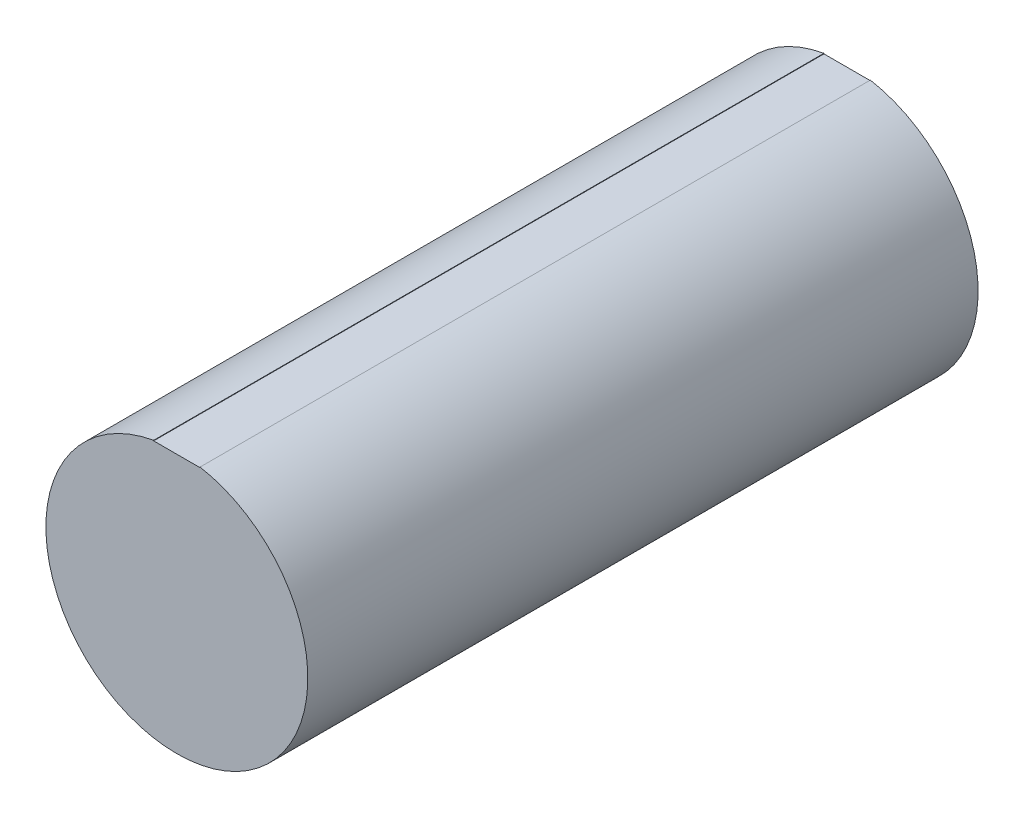
ISO-10303-21;
HEADER;
FILE_DESCRIPTION(('STEP AP214'),'2;1');
FILE_NAME('part.step','',(''),(''),'','','');
FILE_SCHEMA(('AUTOMOTIVE_DESIGN { 1 0 10303 214 1 1 1 1 }'));
ENDSEC;
DATA;
#1=APPLICATION_CONTEXT('core data for automotive mechanical design processes');
#2=APPLICATION_PROTOCOL_DEFINITION('international standard','automotive_design',2000,#1);
#3=PRODUCT_CONTEXT('',#1,'mechanical');
#4=PRODUCT('Part','Part','',(#3));
#5=PRODUCT_RELATED_PRODUCT_CATEGORY('part','',(#4));
#6=PRODUCT_DEFINITION_FORMATION('','',#4);
#7=PRODUCT_DEFINITION_CONTEXT('part definition',#1,'design');
#8=PRODUCT_DEFINITION('design','',#6,#7);
#9=PRODUCT_DEFINITION_SHAPE('','',#8);
#10=(LENGTH_UNIT() NAMED_UNIT(*) SI_UNIT(.MILLI.,.METRE.));
#11=(NAMED_UNIT(*) PLANE_ANGLE_UNIT() SI_UNIT($,.RADIAN.));
#12=(NAMED_UNIT(*) SI_UNIT($,.STERADIAN.) SOLID_ANGLE_UNIT());
#13=UNCERTAINTY_MEASURE_WITH_UNIT(LENGTH_MEASURE(1.E-05),#10,'distance_accuracy_value','');
#14=(GEOMETRIC_REPRESENTATION_CONTEXT(3) GLOBAL_UNCERTAINTY_ASSIGNED_CONTEXT((#13)) GLOBAL_UNIT_ASSIGNED_CONTEXT((#10,
#11,#12)) REPRESENTATION_CONTEXT('',''));
#15=CARTESIAN_POINT('',(0.,0.,0.));
#16=DIRECTION('',(0.,0.,1.));
#17=DIRECTION('',(1.,0.,0.));
#18=AXIS2_PLACEMENT_3D('',#15,#16,#17);
#19=CARTESIAN_POINT('',(0.,0.,130.));
#20=DIRECTION('',(0.,0.,-1.));
#21=DIRECTION('',(-1.,0.,0.));
#22=AXIS2_PLACEMENT_3D('',#19,#20,#21);
#23=CYLINDRICAL_SURFACE('',#22,25.4);
#24=CARTESIAN_POINT('',(0.,0.,0.));
#25=DIRECTION('',(0.,0.,1.));
#26=DIRECTION('',(1.,0.,0.));
#27=AXIS2_PLACEMENT_3D('',#24,#25,#26);
#28=CIRCLE('',#27,25.4);
#29=CARTESIAN_POINT('',(-4.50000000000003,24.9981999351953,0.));
#30=VERTEX_POINT('',#29);
#31=CARTESIAN_POINT('',(4.49999999999997,24.9981999351953,0.));
#32=VERTEX_POINT('',#31);
#33=EDGE_CURVE('E101',#30,#32,#28,.T.);
#34=ORIENTED_EDGE('',*,*,#33,.T.);
#35=DIRECTION('',(0.,0.,-1.));
#36=VECTOR('',#35,1.);
#37=CARTESIAN_POINT('',(4.49999999999997,24.9981999351953,130.));
#38=LINE('',#37,#36);
#39=CARTESIAN_POINT('',(4.49999999999997,24.9981999351953,130.));
#40=VERTEX_POINT('',#39);
#41=EDGE_CURVE('E99',#32,#40,#38,.F.);
#42=ORIENTED_EDGE('',*,*,#41,.T.);
#43=CARTESIAN_POINT('',(0.,0.,130.));
#44=DIRECTION('',(0.,0.,1.));
#45=DIRECTION('',(1.,0.,0.));
#46=AXIS2_PLACEMENT_3D('',#43,#44,#45);
#47=CIRCLE('',#46,25.4);
#48=CARTESIAN_POINT('',(-4.50000000000003,24.9981999351953,130.));
#49=VERTEX_POINT('',#48);
#50=EDGE_CURVE('E42',#49,#40,#47,.T.);
#51=ORIENTED_EDGE('',*,*,#50,.F.);
#52=DIRECTION('',(0.,0.,-1.));
#53=VECTOR('',#52,1.);
#54=CARTESIAN_POINT('',(-4.50000000000003,24.9981999351953,130.));
#55=LINE('',#54,#53);
#56=EDGE_CURVE('E76',#49,#30,#55,.T.);
#57=ORIENTED_EDGE('',*,*,#56,.T.);
#58=EDGE_LOOP('',(#34,#42,#51,#57));
#59=FACE_BOUND('',#58,.T.);
#60=ADVANCED_FACE('F35',(#59),#23,.T.);
#61=CARTESIAN_POINT('',(0.,0.,130.));
#62=DIRECTION('',(0.,0.,1.));
#63=DIRECTION('',(1.,0.,0.));
#64=AXIS2_PLACEMENT_3D('',#61,#62,#63);
#65=PLANE('',#64);
#66=DIRECTION('',(0.,1.,0.));
#67=VECTOR('',#66,1.);
#68=CARTESIAN_POINT('',(4.49999999999997,24.9,130.));
#69=LINE('',#68,#67);
#70=CARTESIAN_POINT('',(4.49999999999997,24.9,130.));
#71=VERTEX_POINT('',#70);
#72=EDGE_CURVE('E57',#71,#40,#69,.T.);
#73=ORIENTED_EDGE('',*,*,#72,.F.);
#74=DIRECTION('',(1.,0.,0.));
#75=VECTOR('',#74,1.);
#76=CARTESIAN_POINT('',(-4.50000000000003,24.9,130.));
#77=LINE('',#76,#75);
#78=CARTESIAN_POINT('',(-4.50000000000003,24.9,130.));
#79=VERTEX_POINT('',#78);
#80=EDGE_CURVE('E81',#79,#71,#77,.T.);
#81=ORIENTED_EDGE('',*,*,#80,.F.);
#82=DIRECTION('',(0.,-1.,0.));
#83=VECTOR('',#82,1.);
#84=CARTESIAN_POINT('',(-4.50000000000003,24.9,130.));
#85=LINE('',#84,#83);
#86=EDGE_CURVE('E73',#49,#79,#85,.T.);
#87=ORIENTED_EDGE('',*,*,#86,.F.);
#88=ORIENTED_EDGE('',*,*,#50,.T.);
#89=EDGE_LOOP('',(#73,#81,#87,#88));
#90=FACE_BOUND('',#89,.T.);
#91=ADVANCED_FACE('F92',(#90),#65,.T.);
#92=CARTESIAN_POINT('',(0.,0.,0.));
#93=DIRECTION('',(0.,0.,1.));
#94=DIRECTION('',(1.,0.,0.));
#95=AXIS2_PLACEMENT_3D('',#92,#93,#94);
#96=PLANE('',#95);
#97=DIRECTION('',(-1.,0.,0.));
#98=VECTOR('',#97,1.);
#99=CARTESIAN_POINT('',(-4.50000000000003,24.9,0.));
#100=LINE('',#99,#98);
#101=CARTESIAN_POINT('',(4.49999999999997,24.9,0.));
#102=VERTEX_POINT('',#101);
#103=CARTESIAN_POINT('',(-4.50000000000003,24.9,0.));
#104=VERTEX_POINT('',#103);
#105=EDGE_CURVE('E88',#102,#104,#100,.T.);
#106=ORIENTED_EDGE('',*,*,#105,.F.);
#107=DIRECTION('',(0.,1.,0.));
#108=VECTOR('',#107,1.);
#109=CARTESIAN_POINT('',(4.49999999999997,0.,0.));
#110=LINE('',#109,#108);
#111=EDGE_CURVE('E11',#102,#32,#110,.T.);
#112=ORIENTED_EDGE('',*,*,#111,.T.);
#113=ORIENTED_EDGE('',*,*,#33,.F.);
#114=DIRECTION('',(0.,1.,0.));
#115=VECTOR('',#114,1.);
#116=CARTESIAN_POINT('',(-4.50000000000003,24.9,0.));
#117=LINE('',#116,#115);
#118=EDGE_CURVE('E96',#104,#30,#117,.T.);
#119=ORIENTED_EDGE('',*,*,#118,.F.);
#120=EDGE_LOOP('',(#106,#112,#113,#119));
#121=FACE_BOUND('',#120,.T.);
#122=ADVANCED_FACE('F106',(#121),#96,.F.);
#123=CARTESIAN_POINT('',(4.49999999999997,24.9,-9.05538513813742));
#124=DIRECTION('',(1.,0.,0.));
#125=DIRECTION('',(0.,0.,-1.));
#126=AXIS2_PLACEMENT_3D('',#123,#124,#125);
#127=PLANE('',#126);
#128=ORIENTED_EDGE('',*,*,#111,.F.);
#129=DIRECTION('',(0.,0.,1.));
#130=VECTOR('',#129,1.);
#131=CARTESIAN_POINT('',(4.49999999999997,24.9,-9.05538513813742));
#132=LINE('',#131,#130);
#133=EDGE_CURVE('E90',#102,#71,#132,.T.);
#134=ORIENTED_EDGE('',*,*,#133,.T.);
#135=ORIENTED_EDGE('',*,*,#72,.T.);
#136=ORIENTED_EDGE('',*,*,#41,.F.);
#137=EDGE_LOOP('',(#128,#134,#135,#136));
#138=FACE_BOUND('',#137,.T.);
#139=ADVANCED_FACE('F107',(#138),#127,.F.);
#140=CARTESIAN_POINT('',(-4.50000000000003,24.9,-9.05538513813742));
#141=DIRECTION('',(-1.,0.,0.));
#142=DIRECTION('',(0.,0.,1.));
#143=AXIS2_PLACEMENT_3D('',#140,#141,#142);
#144=PLANE('',#143);
#145=ORIENTED_EDGE('',*,*,#86,.T.);
#146=DIRECTION('',(0.,0.,1.));
#147=VECTOR('',#146,1.);
#148=CARTESIAN_POINT('',(-4.50000000000003,24.9,-9.05538513813742));
#149=LINE('',#148,#147);
#150=EDGE_CURVE('E49',#104,#79,#149,.T.);
#151=ORIENTED_EDGE('',*,*,#150,.F.);
#152=ORIENTED_EDGE('',*,*,#118,.T.);
#153=ORIENTED_EDGE('',*,*,#56,.F.);
#154=EDGE_LOOP('',(#145,#151,#152,#153));
#155=FACE_BOUND('',#154,.T.);
#156=ADVANCED_FACE('F74',(#155),#144,.F.);
#157=CARTESIAN_POINT('',(-4.50000000000003,24.9,-9.05538513813742));
#158=DIRECTION('',(0.,-1.,0.));
#159=DIRECTION('',(0.,0.,-1.));
#160=AXIS2_PLACEMENT_3D('',#157,#158,#159);
#161=PLANE('',#160);
#162=ORIENTED_EDGE('',*,*,#105,.T.);
#163=ORIENTED_EDGE('',*,*,#150,.T.);
#164=ORIENTED_EDGE('',*,*,#80,.T.);
#165=ORIENTED_EDGE('',*,*,#133,.F.);
#166=EDGE_LOOP('',(#162,#163,#164,#165));
#167=FACE_BOUND('',#166,.T.);
#168=ADVANCED_FACE('F85',(#167),#161,.F.);
#169=CLOSED_SHELL('',(#60,#91,#122,#139,#156,#168));
#170=MANIFOLD_SOLID_BREP('B2',#169);
#171=ADVANCED_BREP_SHAPE_REPRESENTATION('',(#18,#170),#14);
#172=SHAPE_DEFINITION_REPRESENTATION(#9,#171);
ENDSEC;
END-ISO-10303-21;
